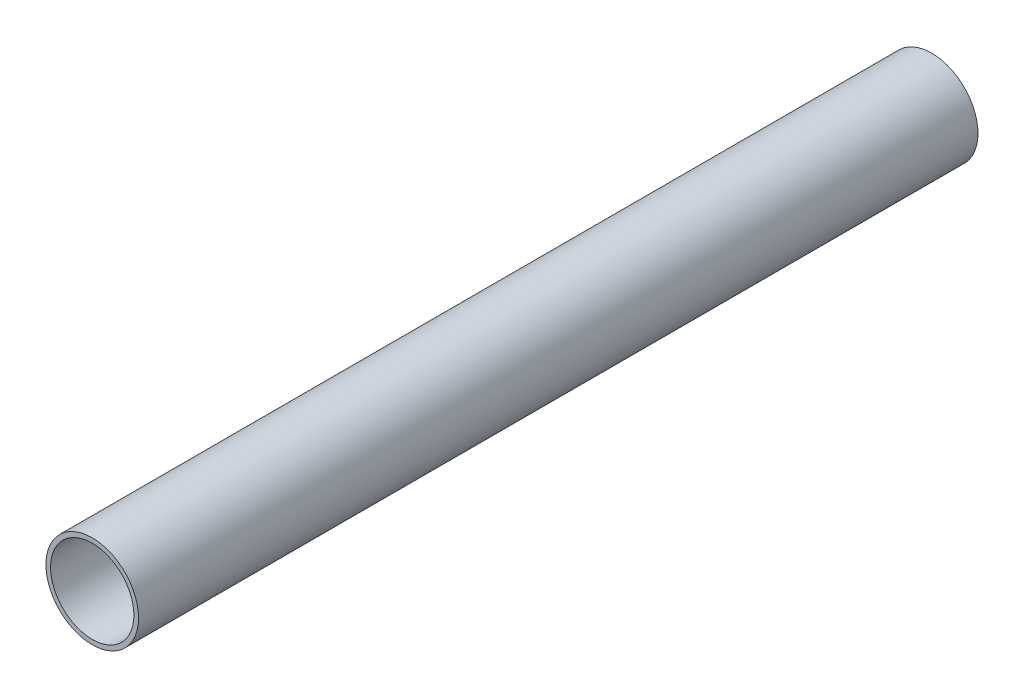
ISO-10303-21;
HEADER;
FILE_DESCRIPTION(('STEP AP214'),'2;1');
FILE_NAME('part.step','',(''),(''),'','','');
FILE_SCHEMA(('AUTOMOTIVE_DESIGN { 1 0 10303 214 1 1 1 1 }'));
ENDSEC;
DATA;
#1=APPLICATION_CONTEXT('core data for automotive mechanical design processes');
#2=APPLICATION_PROTOCOL_DEFINITION('international standard','automotive_design',2000,#1);
#3=PRODUCT_CONTEXT('',#1,'mechanical');
#4=PRODUCT('Part','Part','',(#3));
#5=PRODUCT_RELATED_PRODUCT_CATEGORY('part','',(#4));
#6=PRODUCT_DEFINITION_FORMATION('','',#4);
#7=PRODUCT_DEFINITION_CONTEXT('part definition',#1,'design');
#8=PRODUCT_DEFINITION('design','',#6,#7);
#9=PRODUCT_DEFINITION_SHAPE('','',#8);
#10=(LENGTH_UNIT() NAMED_UNIT(*) SI_UNIT(.MILLI.,.METRE.));
#11=(NAMED_UNIT(*) PLANE_ANGLE_UNIT() SI_UNIT($,.RADIAN.));
#12=(NAMED_UNIT(*) SI_UNIT($,.STERADIAN.) SOLID_ANGLE_UNIT());
#13=UNCERTAINTY_MEASURE_WITH_UNIT(LENGTH_MEASURE(1.E-05),#10,'distance_accuracy_value','');
#14=(GEOMETRIC_REPRESENTATION_CONTEXT(3) GLOBAL_UNCERTAINTY_ASSIGNED_CONTEXT((#13)) GLOBAL_UNIT_ASSIGNED_CONTEXT((#10,
#11,#12)) REPRESENTATION_CONTEXT('',''));
#15=CARTESIAN_POINT('',(0.,0.,0.));
#16=DIRECTION('',(0.,0.,1.));
#17=DIRECTION('',(1.,0.,0.));
#18=AXIS2_PLACEMENT_3D('',#15,#16,#17);
#19=CARTESIAN_POINT('',(0.,0.,72.5));
#20=DIRECTION('',(0.,0.,1.));
#21=DIRECTION('',(1.,0.,0.));
#22=AXIS2_PLACEMENT_3D('',#19,#20,#21);
#23=PLANE('',#22);
#24=CARTESIAN_POINT('',(0.,0.,72.5));
#25=DIRECTION('',(0.,0.,1.));
#26=DIRECTION('',(1.,0.,0.));
#27=AXIS2_PLACEMENT_3D('',#24,#25,#26);
#28=CIRCLE('',#27,8.);
#29=CARTESIAN_POINT('',(8.,0.,72.5));
#30=VERTEX_POINT('',#29);
#31=EDGE_CURVE('E10',#30,#30,#28,.T.);
#32=ORIENTED_EDGE('',*,*,#31,.T.);
#33=EDGE_LOOP('',(#32));
#34=FACE_BOUND('',#33,.T.);
#35=CARTESIAN_POINT('',(0.,0.,72.5));
#36=DIRECTION('',(0.,0.,1.));
#37=DIRECTION('',(1.,0.,0.));
#38=AXIS2_PLACEMENT_3D('',#35,#36,#37);
#39=CIRCLE('',#38,7.2);
#40=CARTESIAN_POINT('',(7.2,0.,72.5));
#41=VERTEX_POINT('',#40);
#42=EDGE_CURVE('E41',#41,#41,#39,.T.);
#43=ORIENTED_EDGE('',*,*,#42,.F.);
#44=EDGE_LOOP('',(#43));
#45=FACE_BOUND('',#44,.T.);
#46=ADVANCED_FACE('F30',(#34,#45),#23,.T.);
#47=CARTESIAN_POINT('',(0.,0.,-72.5));
#48=DIRECTION('',(0.,0.,1.));
#49=DIRECTION('',(1.,0.,0.));
#50=AXIS2_PLACEMENT_3D('',#47,#48,#49);
#51=PLANE('',#50);
#52=CARTESIAN_POINT('',(0.,0.,-72.5));
#53=DIRECTION('',(0.,0.,1.));
#54=DIRECTION('',(1.,0.,0.));
#55=AXIS2_PLACEMENT_3D('',#52,#53,#54);
#56=CIRCLE('',#55,8.);
#57=CARTESIAN_POINT('',(8.,0.,-72.5));
#58=VERTEX_POINT('',#57);
#59=EDGE_CURVE('E34',#58,#58,#56,.T.);
#60=ORIENTED_EDGE('',*,*,#59,.F.);
#61=EDGE_LOOP('',(#60));
#62=FACE_BOUND('',#61,.T.);
#63=CARTESIAN_POINT('',(0.,0.,-72.5));
#64=DIRECTION('',(0.,0.,1.));
#65=DIRECTION('',(1.,0.,0.));
#66=AXIS2_PLACEMENT_3D('',#63,#64,#65);
#67=CIRCLE('',#66,7.2);
#68=CARTESIAN_POINT('',(7.2,0.,-72.5));
#69=VERTEX_POINT('',#68);
#70=EDGE_CURVE('E43',#69,#69,#67,.T.);
#71=ORIENTED_EDGE('',*,*,#70,.T.);
#72=EDGE_LOOP('',(#71));
#73=FACE_BOUND('',#72,.T.);
#74=ADVANCED_FACE('F53',(#62,#73),#51,.F.);
#75=CARTESIAN_POINT('',(0.,0.,72.5));
#76=DIRECTION('',(0.,0.,-1.));
#77=DIRECTION('',(-1.,0.,0.));
#78=AXIS2_PLACEMENT_3D('',#75,#76,#77);
#79=CYLINDRICAL_SURFACE('',#78,8.);
#80=ORIENTED_EDGE('',*,*,#31,.F.);
#81=EDGE_LOOP('',(#80));
#82=FACE_BOUND('',#81,.T.);
#83=ORIENTED_EDGE('',*,*,#59,.T.);
#84=EDGE_LOOP('',(#83));
#85=FACE_BOUND('',#84,.T.);
#86=ADVANCED_FACE('F32',(#82,#85),#79,.T.);
#87=CARTESIAN_POINT('',(0.,0.,72.5));
#88=DIRECTION('',(0.,0.,-1.));
#89=DIRECTION('',(-1.,0.,0.));
#90=AXIS2_PLACEMENT_3D('',#87,#88,#89);
#91=CYLINDRICAL_SURFACE('',#90,7.2);
#92=ORIENTED_EDGE('',*,*,#42,.T.);
#93=EDGE_LOOP('',(#92));
#94=FACE_BOUND('',#93,.T.);
#95=ORIENTED_EDGE('',*,*,#70,.F.);
#96=EDGE_LOOP('',(#95));
#97=FACE_BOUND('',#96,.T.);
#98=ADVANCED_FACE('F49',(#94,#97),#91,.F.);
#99=CLOSED_SHELL('',(#46,#74,#86,#98));
#100=MANIFOLD_SOLID_BREP('B2',#99);
#101=ADVANCED_BREP_SHAPE_REPRESENTATION('',(#18,#100),#14);
#102=SHAPE_DEFINITION_REPRESENTATION(#9,#101);
ENDSEC;
END-ISO-10303-21;
